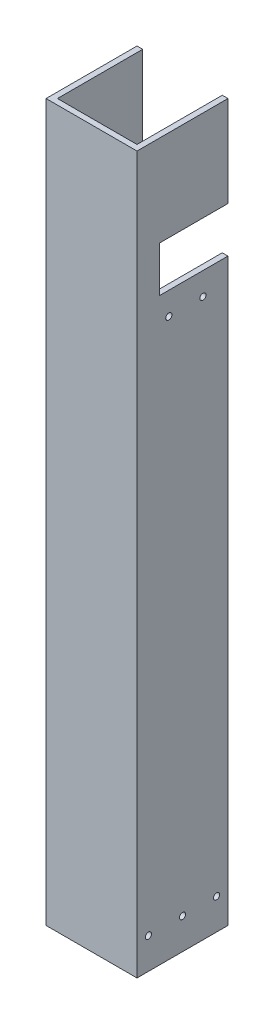
ISO-10303-21;
HEADER;
FILE_DESCRIPTION(('STEP AP214'),'2;1');
FILE_NAME('part.step','',(''),(''),'','','');
FILE_SCHEMA(('AUTOMOTIVE_DESIGN { 1 0 10303 214 1 1 1 1 }'));
ENDSEC;
DATA;
#1=APPLICATION_CONTEXT('core data for automotive mechanical design processes');
#2=APPLICATION_PROTOCOL_DEFINITION('international standard','automotive_design',2000,#1);
#3=PRODUCT_CONTEXT('',#1,'mechanical');
#4=PRODUCT('Part','Part','',(#3));
#5=PRODUCT_RELATED_PRODUCT_CATEGORY('part','',(#4));
#6=PRODUCT_DEFINITION_FORMATION('','',#4);
#7=PRODUCT_DEFINITION_CONTEXT('part definition',#1,'design');
#8=PRODUCT_DEFINITION('design','',#6,#7);
#9=PRODUCT_DEFINITION_SHAPE('','',#8);
#10=(LENGTH_UNIT() NAMED_UNIT(*) SI_UNIT(.MILLI.,.METRE.));
#11=(NAMED_UNIT(*) PLANE_ANGLE_UNIT() SI_UNIT($,.RADIAN.));
#12=(NAMED_UNIT(*) SI_UNIT($,.STERADIAN.) SOLID_ANGLE_UNIT());
#13=UNCERTAINTY_MEASURE_WITH_UNIT(LENGTH_MEASURE(1.E-05),#10,'distance_accuracy_value','');
#14=(GEOMETRIC_REPRESENTATION_CONTEXT(3) GLOBAL_UNCERTAINTY_ASSIGNED_CONTEXT((#13)) GLOBAL_UNIT_ASSIGNED_CONTEXT((#10,
#11,#12)) REPRESENTATION_CONTEXT('',''));
#15=CARTESIAN_POINT('',(0.,0.,0.));
#16=DIRECTION('',(0.,0.,1.));
#17=DIRECTION('',(1.,0.,0.));
#18=AXIS2_PLACEMENT_3D('',#15,#16,#17);
#19=CARTESIAN_POINT('',(50.8,400.,50.8));
#20=DIRECTION('',(-1.,0.,0.));
#21=DIRECTION('',(0.,0.,1.));
#22=AXIS2_PLACEMENT_3D('',#19,#20,#21);
#23=PLANE('',#22);
#24=DIRECTION('',(0.,-1.,0.));
#25=VECTOR('',#24,1.);
#26=CARTESIAN_POINT('',(50.8,349.2,38.1));
#27=LINE('',#26,#25);
#28=CARTESIAN_POINT('',(50.8,349.2,38.1));
#29=VERTEX_POINT('',#28);
#30=CARTESIAN_POINT('',(50.8,323.8,38.1));
#31=VERTEX_POINT('',#30);
#32=EDGE_CURVE('E216',#29,#31,#27,.T.);
#33=ORIENTED_EDGE('',*,*,#32,.F.);
#34=DIRECTION('',(0.,0.,-1.));
#35=VECTOR('',#34,1.);
#36=CARTESIAN_POINT('',(50.8,349.2,38.1));
#37=LINE('',#36,#35);
#38=CARTESIAN_POINT('',(50.8,349.2,0.));
#39=VERTEX_POINT('',#38);
#40=EDGE_CURVE('E149',#29,#39,#37,.T.);
#41=ORIENTED_EDGE('',*,*,#40,.T.);
#42=DIRECTION('',(0.,-1.,0.));
#43=VECTOR('',#42,1.);
#44=CARTESIAN_POINT('',(50.8,400.,0.));
#45=LINE('',#44,#43);
#46=CARTESIAN_POINT('',(50.8,400.,0.));
#47=VERTEX_POINT('',#46);
#48=EDGE_CURVE('E169',#47,#39,#45,.T.);
#49=ORIENTED_EDGE('',*,*,#48,.F.);
#50=DIRECTION('',(0.,0.,-1.));
#51=VECTOR('',#50,1.);
#52=CARTESIAN_POINT('',(50.8,400.,50.8));
#53=LINE('',#52,#51);
#54=CARTESIAN_POINT('',(50.8,400.,50.8));
#55=VERTEX_POINT('',#54);
#56=EDGE_CURVE('E195',#55,#47,#53,.T.);
#57=ORIENTED_EDGE('',*,*,#56,.F.);
#58=DIRECTION('',(0.,-1.,0.));
#59=VECTOR('',#58,1.);
#60=CARTESIAN_POINT('',(50.8,400.,50.8));
#61=LINE('',#60,#59);
#62=CARTESIAN_POINT('',(50.8,0.,50.8));
#63=VERTEX_POINT('',#62);
#64=EDGE_CURVE('E172',#55,#63,#61,.T.);
#65=ORIENTED_EDGE('',*,*,#64,.T.);
#66=DIRECTION('',(0.,0.,-1.));
#67=VECTOR('',#66,1.);
#68=CARTESIAN_POINT('',(50.8,0.,50.8));
#69=LINE('',#68,#67);
#70=CARTESIAN_POINT('',(50.8,0.,0.));
#71=VERTEX_POINT('',#70);
#72=EDGE_CURVE('E153',#63,#71,#69,.T.);
#73=ORIENTED_EDGE('',*,*,#72,.T.);
#74=CARTESIAN_POINT('',(50.8,323.8,0.));
#75=VERTEX_POINT('',#74);
#76=EDGE_CURVE('E168',#75,#71,#45,.T.);
#77=ORIENTED_EDGE('',*,*,#76,.F.);
#78=DIRECTION('',(0.,0.,-1.));
#79=VECTOR('',#78,1.);
#80=CARTESIAN_POINT('',(50.8,323.8,38.1));
#81=LINE('',#80,#79);
#82=EDGE_CURVE('E202',#31,#75,#81,.T.);
#83=ORIENTED_EDGE('',*,*,#82,.F.);
#84=EDGE_LOOP('',(#33,#41,#49,#57,#65,#73,#77,#83));
#85=FACE_BOUND('',#84,.T.);
#86=CARTESIAN_POINT('',(50.8,17.3,6.34999999999999));
#87=DIRECTION('',(1.,0.,0.));
#88=DIRECTION('',(0.,0.,-1.));
#89=AXIS2_PLACEMENT_3D('',#86,#87,#88);
#90=CIRCLE('',#89,1.72719999999999);
#91=CARTESIAN_POINT('',(50.8,17.3,4.62280000000001));
#92=VERTEX_POINT('',#91);
#93=EDGE_CURVE('E235',#92,#92,#90,.T.);
#94=ORIENTED_EDGE('',*,*,#93,.F.);
#95=EDGE_LOOP('',(#94));
#96=FACE_BOUND('',#95,.T.);
#97=CARTESIAN_POINT('',(50.8,17.3,25.4));
#98=DIRECTION('',(1.,0.,0.));
#99=DIRECTION('',(0.,0.,-1.));
#100=AXIS2_PLACEMENT_3D('',#97,#98,#99);
#101=CIRCLE('',#100,1.72719999999999);
#102=CARTESIAN_POINT('',(50.8,17.3,23.6728));
#103=VERTEX_POINT('',#102);
#104=EDGE_CURVE('E247',#103,#103,#101,.T.);
#105=ORIENTED_EDGE('',*,*,#104,.F.);
#106=EDGE_LOOP('',(#105));
#107=FACE_BOUND('',#106,.T.);
#108=CARTESIAN_POINT('',(50.8,17.3,44.45));
#109=DIRECTION('',(1.,0.,0.));
#110=DIRECTION('',(0.,0.,-1.));
#111=AXIS2_PLACEMENT_3D('',#108,#109,#110);
#112=CIRCLE('',#111,1.72719999999999);
#113=CARTESIAN_POINT('',(50.8,17.3,42.7228));
#114=VERTEX_POINT('',#113);
#115=EDGE_CURVE('E256',#114,#114,#112,.T.);
#116=ORIENTED_EDGE('',*,*,#115,.F.);
#117=EDGE_LOOP('',(#116));
#118=FACE_BOUND('',#117,.T.);
#119=CARTESIAN_POINT('',(50.8,311.1,13.97));
#120=DIRECTION('',(1.,0.,0.));
#121=DIRECTION('',(0.,0.,-1.));
#122=AXIS2_PLACEMENT_3D('',#119,#120,#121);
#123=CIRCLE('',#122,1.72719999999998);
#124=CARTESIAN_POINT('',(50.8,311.1,12.2428));
#125=VERTEX_POINT('',#124);
#126=EDGE_CURVE('E262',#125,#125,#123,.T.);
#127=ORIENTED_EDGE('',*,*,#126,.F.);
#128=EDGE_LOOP('',(#127));
#129=FACE_BOUND('',#128,.T.);
#130=CARTESIAN_POINT('',(50.8,311.1,33.02));
#131=DIRECTION('',(1.,0.,0.));
#132=DIRECTION('',(0.,0.,-1.));
#133=AXIS2_PLACEMENT_3D('',#130,#131,#132);
#134=CIRCLE('',#133,1.72719999999998);
#135=CARTESIAN_POINT('',(50.8,311.1,31.2928));
#136=VERTEX_POINT('',#135);
#137=EDGE_CURVE('E268',#136,#136,#134,.T.);
#138=ORIENTED_EDGE('',*,*,#137,.F.);
#139=EDGE_LOOP('',(#138));
#140=FACE_BOUND('',#139,.T.);
#141=ADVANCED_FACE('F35',(#85,#96,#107,#118,#129,#140),#23,.F.);
#142=CARTESIAN_POINT('',(50.8,400.,0.));
#143=DIRECTION('',(0.,0.,1.));
#144=DIRECTION('',(1.,0.,0.));
#145=AXIS2_PLACEMENT_3D('',#142,#143,#144);
#146=PLANE('',#145);
#147=ORIENTED_EDGE('',*,*,#48,.T.);
#148=DIRECTION('',(1.,0.,0.));
#149=VECTOR('',#148,1.);
#150=CARTESIAN_POINT('',(50.8,349.2,0.));
#151=LINE('',#150,#149);
#152=CARTESIAN_POINT('',(47.625,349.2,0.));
#153=VERTEX_POINT('',#152);
#154=EDGE_CURVE('E213',#153,#39,#151,.T.);
#155=ORIENTED_EDGE('',*,*,#154,.F.);
#156=DIRECTION('',(0.,-1.,0.));
#157=VECTOR('',#156,1.);
#158=CARTESIAN_POINT('',(47.625,400.,0.));
#159=LINE('',#158,#157);
#160=CARTESIAN_POINT('',(47.625,400.,0.));
#161=VERTEX_POINT('',#160);
#162=EDGE_CURVE('E166',#161,#153,#159,.T.);
#163=ORIENTED_EDGE('',*,*,#162,.F.);
#164=DIRECTION('',(-1.,0.,0.));
#165=VECTOR('',#164,1.);
#166=CARTESIAN_POINT('',(50.8,400.,0.));
#167=LINE('',#166,#165);
#168=EDGE_CURVE('E124',#47,#161,#167,.T.);
#169=ORIENTED_EDGE('',*,*,#168,.F.);
#170=EDGE_LOOP('',(#147,#155,#163,#169));
#171=FACE_BOUND('',#170,.T.);
#172=ADVANCED_FACE('F275',(#171),#146,.F.);
#173=CARTESIAN_POINT('',(3.175,400.,0.));
#174=DIRECTION('',(0.,0.,1.));
#175=DIRECTION('',(1.,0.,0.));
#176=AXIS2_PLACEMENT_3D('',#173,#174,#175);
#177=PLANE('',#176);
#178=DIRECTION('',(-1.,0.,0.));
#179=VECTOR('',#178,1.);
#180=CARTESIAN_POINT('',(3.175,0.,0.));
#181=LINE('',#180,#179);
#182=CARTESIAN_POINT('',(3.175,0.,0.));
#183=VERTEX_POINT('',#182);
#184=CARTESIAN_POINT('',(0.,0.,0.));
#185=VERTEX_POINT('',#184);
#186=EDGE_CURVE('E145',#183,#185,#181,.T.);
#187=ORIENTED_EDGE('',*,*,#186,.T.);
#188=DIRECTION('',(0.,-1.,0.));
#189=VECTOR('',#188,1.);
#190=CARTESIAN_POINT('',(0.,400.,0.));
#191=LINE('',#190,#189);
#192=CARTESIAN_POINT('',(0.,400.,0.));
#193=VERTEX_POINT('',#192);
#194=EDGE_CURVE('E11',#193,#185,#191,.T.);
#195=ORIENTED_EDGE('',*,*,#194,.F.);
#196=DIRECTION('',(-1.,0.,0.));
#197=VECTOR('',#196,1.);
#198=CARTESIAN_POINT('',(3.175,400.,0.));
#199=LINE('',#198,#197);
#200=CARTESIAN_POINT('',(3.175,400.,0.));
#201=VERTEX_POINT('',#200);
#202=EDGE_CURVE('E163',#201,#193,#199,.T.);
#203=ORIENTED_EDGE('',*,*,#202,.F.);
#204=DIRECTION('',(0.,-1.,0.));
#205=VECTOR('',#204,1.);
#206=CARTESIAN_POINT('',(3.175,400.,0.));
#207=LINE('',#206,#205);
#208=EDGE_CURVE('E141',#201,#183,#207,.T.);
#209=ORIENTED_EDGE('',*,*,#208,.T.);
#210=EDGE_LOOP('',(#187,#195,#203,#209));
#211=FACE_BOUND('',#210,.T.);
#212=ADVANCED_FACE('F37',(#211),#177,.F.);
#213=CARTESIAN_POINT('',(0.,400.,0.));
#214=DIRECTION('',(1.,0.,0.));
#215=DIRECTION('',(0.,0.,-1.));
#216=AXIS2_PLACEMENT_3D('',#213,#214,#215);
#217=PLANE('',#216);
#218=CARTESIAN_POINT('',(0.,17.3,44.45));
#219=DIRECTION('',(1.,0.,0.));
#220=DIRECTION('',(0.,0.,-1.));
#221=AXIS2_PLACEMENT_3D('',#218,#219,#220);
#222=CIRCLE('',#221,1.72719999999999);
#223=CARTESIAN_POINT('',(0.,17.3,42.7228));
#224=VERTEX_POINT('',#223);
#225=EDGE_CURVE('E253',#224,#224,#222,.T.);
#226=ORIENTED_EDGE('',*,*,#225,.T.);
#227=EDGE_LOOP('',(#226));
#228=FACE_BOUND('',#227,.T.);
#229=CARTESIAN_POINT('',(0.,17.3,25.4));
#230=DIRECTION('',(1.,0.,0.));
#231=DIRECTION('',(0.,0.,-1.));
#232=AXIS2_PLACEMENT_3D('',#229,#230,#231);
#233=CIRCLE('',#232,1.72719999999999);
#234=CARTESIAN_POINT('',(0.,17.3,23.6728));
#235=VERTEX_POINT('',#234);
#236=EDGE_CURVE('E244',#235,#235,#233,.T.);
#237=ORIENTED_EDGE('',*,*,#236,.T.);
#238=EDGE_LOOP('',(#237));
#239=FACE_BOUND('',#238,.T.);
#240=CARTESIAN_POINT('',(0.,17.3,6.34999999999999));
#241=DIRECTION('',(1.,0.,0.));
#242=DIRECTION('',(0.,0.,-1.));
#243=AXIS2_PLACEMENT_3D('',#240,#241,#242);
#244=CIRCLE('',#243,1.72719999999999);
#245=CARTESIAN_POINT('',(0.,17.3,4.6228));
#246=VERTEX_POINT('',#245);
#247=EDGE_CURVE('E232',#246,#246,#244,.T.);
#248=ORIENTED_EDGE('',*,*,#247,.T.);
#249=EDGE_LOOP('',(#248));
#250=FACE_BOUND('',#249,.T.);
#251=DIRECTION('',(0.,0.,1.));
#252=VECTOR('',#251,1.);
#253=CARTESIAN_POINT('',(0.,0.,0.));
#254=LINE('',#253,#252);
#255=CARTESIAN_POINT('',(0.,0.,50.8));
#256=VERTEX_POINT('',#255);
#257=EDGE_CURVE('E148',#185,#256,#254,.T.);
#258=ORIENTED_EDGE('',*,*,#257,.T.);
#259=DIRECTION('',(0.,-1.,0.));
#260=VECTOR('',#259,1.);
#261=CARTESIAN_POINT('',(0.,400.,50.8));
#262=LINE('',#261,#260);
#263=CARTESIAN_POINT('',(0.,400.,50.8));
#264=VERTEX_POINT('',#263);
#265=EDGE_CURVE('E44',#264,#256,#262,.T.);
#266=ORIENTED_EDGE('',*,*,#265,.F.);
#267=DIRECTION('',(0.,0.,1.));
#268=VECTOR('',#267,1.);
#269=CARTESIAN_POINT('',(0.,400.,0.));
#270=LINE('',#269,#268);
#271=EDGE_CURVE('E101',#193,#264,#270,.T.);
#272=ORIENTED_EDGE('',*,*,#271,.F.);
#273=ORIENTED_EDGE('',*,*,#194,.T.);
#274=EDGE_LOOP('',(#258,#266,#272,#273));
#275=FACE_BOUND('',#274,.T.);
#276=ADVANCED_FACE('F288',(#228,#239,#250,#275),#217,.F.);
#277=CARTESIAN_POINT('',(0.,400.,50.8));
#278=DIRECTION('',(0.,0.,-1.));
#279=DIRECTION('',(-1.,0.,0.));
#280=AXIS2_PLACEMENT_3D('',#277,#278,#279);
#281=PLANE('',#280);
#282=DIRECTION('',(1.,0.,0.));
#283=VECTOR('',#282,1.);
#284=CARTESIAN_POINT('',(0.,0.,50.8));
#285=LINE('',#284,#283);
#286=EDGE_CURVE('E151',#256,#63,#285,.T.);
#287=ORIENTED_EDGE('',*,*,#286,.T.);
#288=ORIENTED_EDGE('',*,*,#64,.F.);
#289=DIRECTION('',(1.,0.,0.));
#290=VECTOR('',#289,1.);
#291=CARTESIAN_POINT('',(0.,400.,50.8));
#292=LINE('',#291,#290);
#293=EDGE_CURVE('E181',#264,#55,#292,.T.);
#294=ORIENTED_EDGE('',*,*,#293,.F.);
#295=ORIENTED_EDGE('',*,*,#265,.T.);
#296=EDGE_LOOP('',(#287,#288,#294,#295));
#297=FACE_BOUND('',#296,.T.);
#298=ADVANCED_FACE('F179',(#297),#281,.F.);
#299=CARTESIAN_POINT('',(47.625,323.8,0.));
#300=VERTEX_POINT('',#299);
#301=CARTESIAN_POINT('',(47.625,0.,0.));
#302=VERTEX_POINT('',#301);
#303=EDGE_CURVE('E136',#300,#302,#159,.T.);
#304=ORIENTED_EDGE('',*,*,#303,.F.);
#305=DIRECTION('',(-1.,0.,0.));
#306=VECTOR('',#305,1.);
#307=CARTESIAN_POINT('',(50.8,323.8,0.));
#308=LINE('',#307,#306);
#309=EDGE_CURVE('E217',#75,#300,#308,.T.);
#310=ORIENTED_EDGE('',*,*,#309,.F.);
#311=ORIENTED_EDGE('',*,*,#76,.T.);
#312=DIRECTION('',(-1.,0.,0.));
#313=VECTOR('',#312,1.);
#314=CARTESIAN_POINT('',(50.8,0.,0.));
#315=LINE('',#314,#313);
#316=EDGE_CURVE('E156',#71,#302,#315,.T.);
#317=ORIENTED_EDGE('',*,*,#316,.T.);
#318=EDGE_LOOP('',(#304,#310,#311,#317));
#319=FACE_BOUND('',#318,.T.);
#320=ADVANCED_FACE('F284',(#319),#146,.F.);
#321=CARTESIAN_POINT('',(47.625,400.,0.));
#322=DIRECTION('',(1.,0.,0.));
#323=DIRECTION('',(0.,0.,-1.));
#324=AXIS2_PLACEMENT_3D('',#321,#322,#323);
#325=PLANE('',#324);
#326=CARTESIAN_POINT('',(47.625,311.1,33.02));
#327=DIRECTION('',(1.,0.,0.));
#328=DIRECTION('',(0.,0.,-1.));
#329=AXIS2_PLACEMENT_3D('',#326,#327,#328);
#330=CIRCLE('',#329,1.72719999999998);
#331=CARTESIAN_POINT('',(47.625,311.1,31.2928));
#332=VERTEX_POINT('',#331);
#333=EDGE_CURVE('E265',#332,#332,#330,.T.);
#334=ORIENTED_EDGE('',*,*,#333,.T.);
#335=EDGE_LOOP('',(#334));
#336=FACE_BOUND('',#335,.T.);
#337=CARTESIAN_POINT('',(47.625,311.1,13.97));
#338=DIRECTION('',(1.,0.,0.));
#339=DIRECTION('',(0.,0.,-1.));
#340=AXIS2_PLACEMENT_3D('',#337,#338,#339);
#341=CIRCLE('',#340,1.72719999999998);
#342=CARTESIAN_POINT('',(47.625,311.1,12.2428));
#343=VERTEX_POINT('',#342);
#344=EDGE_CURVE('E259',#343,#343,#341,.T.);
#345=ORIENTED_EDGE('',*,*,#344,.T.);
#346=EDGE_LOOP('',(#345));
#347=FACE_BOUND('',#346,.T.);
#348=CARTESIAN_POINT('',(47.625,17.3,44.45));
#349=DIRECTION('',(1.,0.,0.));
#350=DIRECTION('',(0.,0.,-1.));
#351=AXIS2_PLACEMENT_3D('',#348,#349,#350);
#352=CIRCLE('',#351,1.72719999999999);
#353=CARTESIAN_POINT('',(47.625,17.3,42.7228));
#354=VERTEX_POINT('',#353);
#355=EDGE_CURVE('E39',#354,#354,#352,.T.);
#356=ORIENTED_EDGE('',*,*,#355,.T.);
#357=EDGE_LOOP('',(#356));
#358=FACE_BOUND('',#357,.T.);
#359=CARTESIAN_POINT('',(47.625,17.3,25.4));
#360=DIRECTION('',(1.,0.,0.));
#361=DIRECTION('',(0.,0.,-1.));
#362=AXIS2_PLACEMENT_3D('',#359,#360,#361);
#363=CIRCLE('',#362,1.72719999999999);
#364=CARTESIAN_POINT('',(47.625,17.3,23.6728));
#365=VERTEX_POINT('',#364);
#366=EDGE_CURVE('E241',#365,#365,#363,.T.);
#367=ORIENTED_EDGE('',*,*,#366,.T.);
#368=EDGE_LOOP('',(#367));
#369=FACE_BOUND('',#368,.T.);
#370=CARTESIAN_POINT('',(47.625,17.3,6.34999999999999));
#371=DIRECTION('',(1.,0.,0.));
#372=DIRECTION('',(0.,0.,-1.));
#373=AXIS2_PLACEMENT_3D('',#370,#371,#372);
#374=CIRCLE('',#373,1.72719999999999);
#375=CARTESIAN_POINT('',(47.625,17.3,4.6228));
#376=VERTEX_POINT('',#375);
#377=EDGE_CURVE('E229',#376,#376,#374,.T.);
#378=ORIENTED_EDGE('',*,*,#377,.T.);
#379=EDGE_LOOP('',(#378));
#380=FACE_BOUND('',#379,.T.);
#381=ORIENTED_EDGE('',*,*,#162,.T.);
#382=DIRECTION('',(0.,0.,-1.));
#383=VECTOR('',#382,1.);
#384=CARTESIAN_POINT('',(47.625,349.2,38.1));
#385=LINE('',#384,#383);
#386=CARTESIAN_POINT('',(47.625,349.2,38.1));
#387=VERTEX_POINT('',#386);
#388=EDGE_CURVE('E209',#387,#153,#385,.T.);
#389=ORIENTED_EDGE('',*,*,#388,.F.);
#390=DIRECTION('',(0.,1.,0.));
#391=VECTOR('',#390,1.);
#392=CARTESIAN_POINT('',(47.625,349.2,38.1));
#393=LINE('',#392,#391);
#394=CARTESIAN_POINT('',(47.625,323.8,38.1));
#395=VERTEX_POINT('',#394);
#396=EDGE_CURVE('E223',#395,#387,#393,.T.);
#397=ORIENTED_EDGE('',*,*,#396,.F.);
#398=DIRECTION('',(0.,0.,-1.));
#399=VECTOR('',#398,1.);
#400=CARTESIAN_POINT('',(47.625,323.8,38.1));
#401=LINE('',#400,#399);
#402=EDGE_CURVE('E205',#395,#300,#401,.T.);
#403=ORIENTED_EDGE('',*,*,#402,.T.);
#404=ORIENTED_EDGE('',*,*,#303,.T.);
#405=DIRECTION('',(0.,0.,1.));
#406=VECTOR('',#405,1.);
#407=CARTESIAN_POINT('',(47.625,0.,0.));
#408=LINE('',#407,#406);
#409=CARTESIAN_POINT('',(47.625,0.,47.625));
#410=VERTEX_POINT('',#409);
#411=EDGE_CURVE('E133',#302,#410,#408,.T.);
#412=ORIENTED_EDGE('',*,*,#411,.T.);
#413=DIRECTION('',(0.,-1.,0.));
#414=VECTOR('',#413,1.);
#415=CARTESIAN_POINT('',(47.625,400.,47.625));
#416=LINE('',#415,#414);
#417=CARTESIAN_POINT('',(47.625,400.,47.625));
#418=VERTEX_POINT('',#417);
#419=EDGE_CURVE('E130',#418,#410,#416,.T.);
#420=ORIENTED_EDGE('',*,*,#419,.F.);
#421=DIRECTION('',(0.,0.,1.));
#422=VECTOR('',#421,1.);
#423=CARTESIAN_POINT('',(47.625,400.,0.));
#424=LINE('',#423,#422);
#425=EDGE_CURVE('E117',#161,#418,#424,.T.);
#426=ORIENTED_EDGE('',*,*,#425,.F.);
#427=EDGE_LOOP('',(#381,#389,#397,#403,#404,#412,#420,#426));
#428=FACE_BOUND('',#427,.T.);
#429=ADVANCED_FACE('F131',(#336,#347,#358,#369,#380,#428),#325,.F.);
#430=CARTESIAN_POINT('',(47.625,400.,47.625));
#431=DIRECTION('',(0.,0.,1.));
#432=DIRECTION('',(1.,0.,0.));
#433=AXIS2_PLACEMENT_3D('',#430,#431,#432);
#434=PLANE('',#433);
#435=DIRECTION('',(-1.,0.,0.));
#436=VECTOR('',#435,1.);
#437=CARTESIAN_POINT('',(47.625,0.,47.625));
#438=LINE('',#437,#436);
#439=CARTESIAN_POINT('',(3.175,0.,47.625));
#440=VERTEX_POINT('',#439);
#441=EDGE_CURVE('E160',#410,#440,#438,.T.);
#442=ORIENTED_EDGE('',*,*,#441,.T.);
#443=DIRECTION('',(0.,-1.,0.));
#444=VECTOR('',#443,1.);
#445=CARTESIAN_POINT('',(3.175,400.,47.625));
#446=LINE('',#445,#444);
#447=CARTESIAN_POINT('',(3.175,400.,47.625));
#448=VERTEX_POINT('',#447);
#449=EDGE_CURVE('E137',#448,#440,#446,.T.);
#450=ORIENTED_EDGE('',*,*,#449,.F.);
#451=DIRECTION('',(-1.,0.,0.));
#452=VECTOR('',#451,1.);
#453=CARTESIAN_POINT('',(47.625,400.,47.625));
#454=LINE('',#453,#452);
#455=EDGE_CURVE('E121',#418,#448,#454,.T.);
#456=ORIENTED_EDGE('',*,*,#455,.F.);
#457=ORIENTED_EDGE('',*,*,#419,.T.);
#458=EDGE_LOOP('',(#442,#450,#456,#457));
#459=FACE_BOUND('',#458,.T.);
#460=ADVANCED_FACE('F139',(#459),#434,.F.);
#461=CARTESIAN_POINT('',(3.175,400.,47.625));
#462=DIRECTION('',(-1.,0.,0.));
#463=DIRECTION('',(0.,0.,1.));
#464=AXIS2_PLACEMENT_3D('',#461,#462,#463);
#465=PLANE('',#464);
#466=CARTESIAN_POINT('',(3.175,17.3,44.45));
#467=DIRECTION('',(-1.,0.,0.));
#468=DIRECTION('',(0.,0.,1.));
#469=AXIS2_PLACEMENT_3D('',#466,#467,#468);
#470=CIRCLE('',#469,1.72719999999999);
#471=CARTESIAN_POINT('',(3.175,17.3,46.1772));
#472=VERTEX_POINT('',#471);
#473=EDGE_CURVE('E250',#472,#472,#470,.T.);
#474=ORIENTED_EDGE('',*,*,#473,.T.);
#475=EDGE_LOOP('',(#474));
#476=FACE_BOUND('',#475,.T.);
#477=CARTESIAN_POINT('',(3.175,17.3,25.4));
#478=DIRECTION('',(-1.,0.,0.));
#479=DIRECTION('',(0.,0.,1.));
#480=AXIS2_PLACEMENT_3D('',#477,#478,#479);
#481=CIRCLE('',#480,1.72719999999999);
#482=CARTESIAN_POINT('',(3.175,17.3,27.1272));
#483=VERTEX_POINT('',#482);
#484=EDGE_CURVE('E238',#483,#483,#481,.T.);
#485=ORIENTED_EDGE('',*,*,#484,.T.);
#486=EDGE_LOOP('',(#485));
#487=FACE_BOUND('',#486,.T.);
#488=CARTESIAN_POINT('',(3.175,17.3,6.34999999999999));
#489=DIRECTION('',(-1.,0.,0.));
#490=DIRECTION('',(0.,0.,1.));
#491=AXIS2_PLACEMENT_3D('',#488,#489,#490);
#492=CIRCLE('',#491,1.72719999999999);
#493=CARTESIAN_POINT('',(3.175,17.3,8.07719999999999));
#494=VERTEX_POINT('',#493);
#495=EDGE_CURVE('E220',#494,#494,#492,.T.);
#496=ORIENTED_EDGE('',*,*,#495,.T.);
#497=EDGE_LOOP('',(#496));
#498=FACE_BOUND('',#497,.T.);
#499=DIRECTION('',(0.,0.,-1.));
#500=VECTOR('',#499,1.);
#501=CARTESIAN_POINT('',(3.175,0.,47.625));
#502=LINE('',#501,#500);
#503=EDGE_CURVE('E93',#440,#183,#502,.T.);
#504=ORIENTED_EDGE('',*,*,#503,.T.);
#505=ORIENTED_EDGE('',*,*,#208,.F.);
#506=DIRECTION('',(0.,0.,-1.));
#507=VECTOR('',#506,1.);
#508=CARTESIAN_POINT('',(3.175,400.,47.625));
#509=LINE('',#508,#507);
#510=EDGE_CURVE('E60',#448,#201,#509,.T.);
#511=ORIENTED_EDGE('',*,*,#510,.F.);
#512=ORIENTED_EDGE('',*,*,#449,.T.);
#513=EDGE_LOOP('',(#504,#505,#511,#512));
#514=FACE_BOUND('',#513,.T.);
#515=ADVANCED_FACE('F304',(#476,#487,#498,#514),#465,.F.);
#516=CARTESIAN_POINT('',(0.,400.,0.));
#517=DIRECTION('',(0.,1.,0.));
#518=DIRECTION('',(0.,0.,1.));
#519=AXIS2_PLACEMENT_3D('',#516,#517,#518);
#520=PLANE('',#519);
#521=ORIENTED_EDGE('',*,*,#202,.T.);
#522=ORIENTED_EDGE('',*,*,#271,.T.);
#523=ORIENTED_EDGE('',*,*,#293,.T.);
#524=ORIENTED_EDGE('',*,*,#56,.T.);
#525=ORIENTED_EDGE('',*,*,#168,.T.);
#526=ORIENTED_EDGE('',*,*,#425,.T.);
#527=ORIENTED_EDGE('',*,*,#455,.T.);
#528=ORIENTED_EDGE('',*,*,#510,.T.);
#529=EDGE_LOOP('',(#521,#522,#523,#524,#525,#526,#527,#528));
#530=FACE_BOUND('',#529,.T.);
#531=ADVANCED_FACE('F119',(#530),#520,.T.);
#532=CARTESIAN_POINT('',(0.,0.,0.));
#533=DIRECTION('',(0.,1.,0.));
#534=DIRECTION('',(0.,0.,1.));
#535=AXIS2_PLACEMENT_3D('',#532,#533,#534);
#536=PLANE('',#535);
#537=ORIENTED_EDGE('',*,*,#186,.F.);
#538=ORIENTED_EDGE('',*,*,#503,.F.);
#539=ORIENTED_EDGE('',*,*,#441,.F.);
#540=ORIENTED_EDGE('',*,*,#411,.F.);
#541=ORIENTED_EDGE('',*,*,#316,.F.);
#542=ORIENTED_EDGE('',*,*,#72,.F.);
#543=ORIENTED_EDGE('',*,*,#286,.F.);
#544=ORIENTED_EDGE('',*,*,#257,.F.);
#545=EDGE_LOOP('',(#537,#538,#539,#540,#541,#542,#543,#544));
#546=FACE_BOUND('',#545,.T.);
#547=ADVANCED_FACE('F185',(#546),#536,.F.);
#548=CARTESIAN_POINT('',(50.8,349.2,38.1));
#549=DIRECTION('',(0.,1.,0.));
#550=DIRECTION('',(0.,0.,1.));
#551=AXIS2_PLACEMENT_3D('',#548,#549,#550);
#552=PLANE('',#551);
#553=ORIENTED_EDGE('',*,*,#154,.T.);
#554=ORIENTED_EDGE('',*,*,#40,.F.);
#555=DIRECTION('',(1.,0.,0.));
#556=VECTOR('',#555,1.);
#557=CARTESIAN_POINT('',(50.8,349.2,38.1));
#558=LINE('',#557,#556);
#559=EDGE_CURVE('E206',#387,#29,#558,.T.);
#560=ORIENTED_EDGE('',*,*,#559,.F.);
#561=ORIENTED_EDGE('',*,*,#388,.T.);
#562=EDGE_LOOP('',(#553,#554,#560,#561));
#563=FACE_BOUND('',#562,.T.);
#564=ADVANCED_FACE('F350',(#563),#552,.F.);
#565=CARTESIAN_POINT('',(50.8,323.8,38.1));
#566=DIRECTION('',(0.,-1.,0.));
#567=DIRECTION('',(0.,0.,-1.));
#568=AXIS2_PLACEMENT_3D('',#565,#566,#567);
#569=PLANE('',#568);
#570=ORIENTED_EDGE('',*,*,#309,.T.);
#571=ORIENTED_EDGE('',*,*,#402,.F.);
#572=DIRECTION('',(-1.,0.,0.));
#573=VECTOR('',#572,1.);
#574=CARTESIAN_POINT('',(50.8,323.8,38.1));
#575=LINE('',#574,#573);
#576=EDGE_CURVE('E51',#31,#395,#575,.T.);
#577=ORIENTED_EDGE('',*,*,#576,.F.);
#578=ORIENTED_EDGE('',*,*,#82,.T.);
#579=EDGE_LOOP('',(#570,#571,#577,#578));
#580=FACE_BOUND('',#579,.T.);
#581=ADVANCED_FACE('F344',(#580),#569,.F.);
#582=CARTESIAN_POINT('',(0.,0.,38.1));
#583=DIRECTION('',(0.,0.,-1.));
#584=DIRECTION('',(-1.,0.,0.));
#585=AXIS2_PLACEMENT_3D('',#582,#583,#584);
#586=PLANE('',#585);
#587=ORIENTED_EDGE('',*,*,#32,.T.);
#588=ORIENTED_EDGE('',*,*,#576,.T.);
#589=ORIENTED_EDGE('',*,*,#396,.T.);
#590=ORIENTED_EDGE('',*,*,#559,.T.);
#591=EDGE_LOOP('',(#587,#588,#589,#590));
#592=FACE_BOUND('',#591,.T.);
#593=ADVANCED_FACE('F336',(#592),#586,.T.);
#594=CARTESIAN_POINT('',(50.8,17.3,6.34999999999999));
#595=DIRECTION('',(1.,0.,0.));
#596=DIRECTION('',(0.,0.,-1.));
#597=AXIS2_PLACEMENT_3D('',#594,#595,#596);
#598=CYLINDRICAL_SURFACE('',#597,1.72719999999999);
#599=ORIENTED_EDGE('',*,*,#93,.T.);
#600=EDGE_LOOP('',(#599));
#601=FACE_BOUND('',#600,.T.);
#602=ORIENTED_EDGE('',*,*,#377,.F.);
#603=EDGE_LOOP('',(#602));
#604=FACE_BOUND('',#603,.T.);
#605=ADVANCED_FACE('F333',(#601,#604),#598,.F.);
#606=ORIENTED_EDGE('',*,*,#247,.F.);
#607=EDGE_LOOP('',(#606));
#608=FACE_BOUND('',#607,.T.);
#609=ORIENTED_EDGE('',*,*,#495,.F.);
#610=EDGE_LOOP('',(#609));
#611=FACE_BOUND('',#610,.T.);
#612=ADVANCED_FACE('F335',(#608,#611),#598,.F.);
#613=CARTESIAN_POINT('',(50.8,17.3,25.4));
#614=DIRECTION('',(1.,0.,0.));
#615=DIRECTION('',(0.,0.,-1.));
#616=AXIS2_PLACEMENT_3D('',#613,#614,#615);
#617=CYLINDRICAL_SURFACE('',#616,1.72719999999999);
#618=ORIENTED_EDGE('',*,*,#104,.T.);
#619=EDGE_LOOP('',(#618));
#620=FACE_BOUND('',#619,.T.);
#621=ORIENTED_EDGE('',*,*,#366,.F.);
#622=EDGE_LOOP('',(#621));
#623=FACE_BOUND('',#622,.T.);
#624=ADVANCED_FACE('F342',(#620,#623),#617,.F.);
#625=ORIENTED_EDGE('',*,*,#236,.F.);
#626=EDGE_LOOP('',(#625));
#627=FACE_BOUND('',#626,.T.);
#628=ORIENTED_EDGE('',*,*,#484,.F.);
#629=EDGE_LOOP('',(#628));
#630=FACE_BOUND('',#629,.T.);
#631=ADVANCED_FACE('F347',(#627,#630),#617,.F.);
#632=CARTESIAN_POINT('',(50.8,17.3,44.45));
#633=DIRECTION('',(1.,0.,0.));
#634=DIRECTION('',(0.,0.,-1.));
#635=AXIS2_PLACEMENT_3D('',#632,#633,#634);
#636=CYLINDRICAL_SURFACE('',#635,1.72719999999999);
#637=ORIENTED_EDGE('',*,*,#115,.T.);
#638=EDGE_LOOP('',(#637));
#639=FACE_BOUND('',#638,.T.);
#640=ORIENTED_EDGE('',*,*,#355,.F.);
#641=EDGE_LOOP('',(#640));
#642=FACE_BOUND('',#641,.T.);
#643=ADVANCED_FACE('F409',(#639,#642),#636,.F.);
#644=ORIENTED_EDGE('',*,*,#225,.F.);
#645=EDGE_LOOP('',(#644));
#646=FACE_BOUND('',#645,.T.);
#647=ORIENTED_EDGE('',*,*,#473,.F.);
#648=EDGE_LOOP('',(#647));
#649=FACE_BOUND('',#648,.T.);
#650=ADVANCED_FACE('F417',(#646,#649),#636,.F.);
#651=CARTESIAN_POINT('',(50.8,311.1,13.97));
#652=DIRECTION('',(1.,0.,0.));
#653=DIRECTION('',(0.,0.,-1.));
#654=AXIS2_PLACEMENT_3D('',#651,#652,#653);
#655=CYLINDRICAL_SURFACE('',#654,1.72719999999998);
#656=ORIENTED_EDGE('',*,*,#344,.F.);
#657=EDGE_LOOP('',(#656));
#658=FACE_BOUND('',#657,.T.);
#659=ORIENTED_EDGE('',*,*,#126,.T.);
#660=EDGE_LOOP('',(#659));
#661=FACE_BOUND('',#660,.T.);
#662=ADVANCED_FACE('F423',(#658,#661),#655,.F.);
#663=CARTESIAN_POINT('',(50.8,311.1,33.02));
#664=DIRECTION('',(1.,0.,0.));
#665=DIRECTION('',(0.,0.,-1.));
#666=AXIS2_PLACEMENT_3D('',#663,#664,#665);
#667=CYLINDRICAL_SURFACE('',#666,1.72719999999998);
#668=ORIENTED_EDGE('',*,*,#333,.F.);
#669=EDGE_LOOP('',(#668));
#670=FACE_BOUND('',#669,.T.);
#671=ORIENTED_EDGE('',*,*,#137,.T.);
#672=EDGE_LOOP('',(#671));
#673=FACE_BOUND('',#672,.T.);
#674=ADVANCED_FACE('F272',(#670,#673),#667,.F.);
#675=CLOSED_SHELL('',(#141,#172,#212,#276,#298,#320,#429,#460,#515,#531,#547,#564,#581,#593,
#605,#612,#624,#631,#643,#650,#662,#674));
#676=MANIFOLD_SOLID_BREP('B2',#675);
#677=ADVANCED_BREP_SHAPE_REPRESENTATION('',(#18,#676),#14);
#678=SHAPE_DEFINITION_REPRESENTATION(#9,#677);
ENDSEC;
END-ISO-10303-21;
